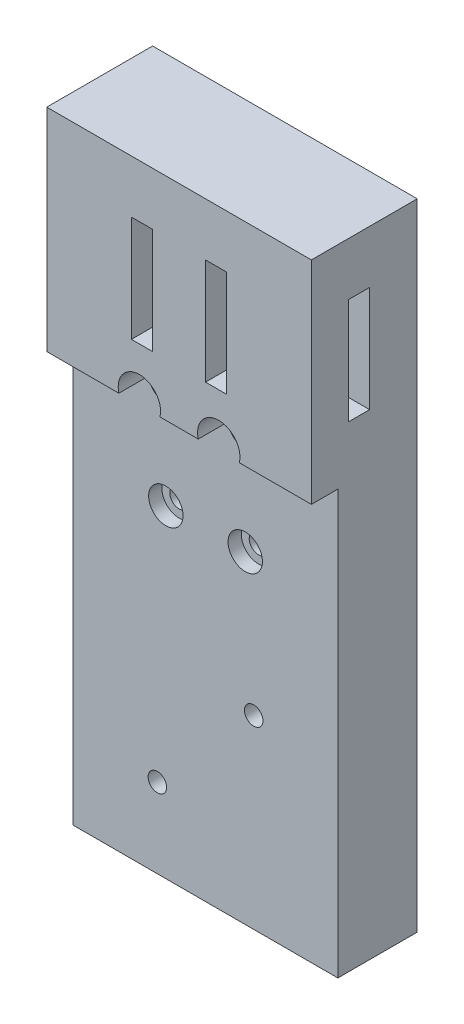
ISO-10303-21;
HEADER;
FILE_DESCRIPTION(('STEP AP214'),'2;1');
FILE_NAME('part.step','',(''),(''),'','','');
FILE_SCHEMA(('AUTOMOTIVE_DESIGN { 1 0 10303 214 1 1 1 1 }'));
ENDSEC;
DATA;
#1=APPLICATION_CONTEXT('core data for automotive mechanical design processes');
#2=APPLICATION_PROTOCOL_DEFINITION('international standard','automotive_design',2000,#1);
#3=PRODUCT_CONTEXT('',#1,'mechanical');
#4=PRODUCT('Part','Part','',(#3));
#5=PRODUCT_RELATED_PRODUCT_CATEGORY('part','',(#4));
#6=PRODUCT_DEFINITION_FORMATION('','',#4);
#7=PRODUCT_DEFINITION_CONTEXT('part definition',#1,'design');
#8=PRODUCT_DEFINITION('design','',#6,#7);
#9=PRODUCT_DEFINITION_SHAPE('','',#8);
#10=(LENGTH_UNIT() NAMED_UNIT(*) SI_UNIT(.MILLI.,.METRE.));
#11=(NAMED_UNIT(*) PLANE_ANGLE_UNIT() SI_UNIT($,.RADIAN.));
#12=(NAMED_UNIT(*) SI_UNIT($,.STERADIAN.) SOLID_ANGLE_UNIT());
#13=UNCERTAINTY_MEASURE_WITH_UNIT(LENGTH_MEASURE(1.E-05),#10,'distance_accuracy_value','');
#14=(GEOMETRIC_REPRESENTATION_CONTEXT(3) GLOBAL_UNCERTAINTY_ASSIGNED_CONTEXT((#13)) GLOBAL_UNIT_ASSIGNED_CONTEXT((#10,
#11,#12)) REPRESENTATION_CONTEXT('',''));
#15=CARTESIAN_POINT('',(0.,0.,0.));
#16=DIRECTION('',(0.,0.,1.));
#17=DIRECTION('',(1.,0.,0.));
#18=AXIS2_PLACEMENT_3D('',#15,#16,#17);
#19=CARTESIAN_POINT('',(32.5000000000006,61.0000000000162,0.));
#20=DIRECTION('',(0.,0.,1.));
#21=DIRECTION('',(1.,0.,0.));
#22=AXIS2_PLACEMENT_3D('',#19,#20,#21);
#23=CYLINDRICAL_SURFACE('',#22,1.74999999999952);
#24=CARTESIAN_POINT('',(32.5000000000006,61.0000000000162,0.));
#25=DIRECTION('',(0.,0.,1.));
#26=DIRECTION('',(1.,0.,0.));
#27=AXIS2_PLACEMENT_3D('',#24,#25,#26);
#28=CIRCLE('',#27,1.74999999999952);
#29=CARTESIAN_POINT('',(34.2500000000001,61.0000000000162,0.));
#30=VERTEX_POINT('',#29);
#31=EDGE_CURVE('E288',#30,#30,#28,.T.);
#32=ORIENTED_EDGE('',*,*,#31,.F.);
#33=EDGE_LOOP('',(#32));
#34=FACE_BOUND('',#33,.T.);
#35=CARTESIAN_POINT('',(32.5000000000006,61.0000000000162,12.5));
#36=DIRECTION('',(0.,0.,1.));
#37=DIRECTION('',(1.,0.,0.));
#38=AXIS2_PLACEMENT_3D('',#35,#36,#37);
#39=CIRCLE('',#38,1.74999999999952);
#40=CARTESIAN_POINT('',(34.2500000000001,61.0000000000162,12.5));
#41=VERTEX_POINT('',#40);
#42=EDGE_CURVE('E41',#41,#41,#39,.F.);
#43=ORIENTED_EDGE('',*,*,#42,.F.);
#44=EDGE_LOOP('',(#43));
#45=FACE_BOUND('',#44,.T.);
#46=ADVANCED_FACE('F37',(#34,#45),#23,.F.);
#47=CARTESIAN_POINT('',(17.5000000000006,61.0000000000163,0.));
#48=DIRECTION('',(0.,0.,1.));
#49=DIRECTION('',(1.,0.,0.));
#50=AXIS2_PLACEMENT_3D('',#47,#48,#49);
#51=CYLINDRICAL_SURFACE('',#50,1.74999999999951);
#52=CARTESIAN_POINT('',(17.5000000000006,61.0000000000163,0.));
#53=DIRECTION('',(0.,0.,1.));
#54=DIRECTION('',(1.,0.,0.));
#55=AXIS2_PLACEMENT_3D('',#52,#53,#54);
#56=CIRCLE('',#55,1.74999999999951);
#57=CARTESIAN_POINT('',(19.2500000000001,61.0000000000163,0.));
#58=VERTEX_POINT('',#57);
#59=EDGE_CURVE('E284',#58,#58,#56,.T.);
#60=ORIENTED_EDGE('',*,*,#59,.F.);
#61=EDGE_LOOP('',(#60));
#62=FACE_BOUND('',#61,.T.);
#63=CARTESIAN_POINT('',(17.5000000000006,61.0000000000163,12.5));
#64=DIRECTION('',(0.,0.,1.));
#65=DIRECTION('',(1.,0.,0.));
#66=AXIS2_PLACEMENT_3D('',#63,#64,#65);
#67=CIRCLE('',#66,1.74999999999951);
#68=CARTESIAN_POINT('',(19.2500000000001,61.0000000000163,12.5));
#69=VERTEX_POINT('',#68);
#70=EDGE_CURVE('E445',#69,#69,#67,.F.);
#71=ORIENTED_EDGE('',*,*,#70,.F.);
#72=EDGE_LOOP('',(#71));
#73=FACE_BOUND('',#72,.T.);
#74=ADVANCED_FACE('F455',(#62,#73),#51,.F.);
#75=CARTESIAN_POINT('',(32.5000000000005,41.0000000000162,0.));
#76=DIRECTION('',(0.,0.,1.));
#77=DIRECTION('',(1.,0.,0.));
#78=AXIS2_PLACEMENT_3D('',#75,#76,#77);
#79=CYLINDRICAL_SURFACE('',#78,1.74999999999952);
#80=CARTESIAN_POINT('',(32.5000000000005,41.0000000000162,0.));
#81=DIRECTION('',(0.,0.,1.));
#82=DIRECTION('',(1.,0.,0.));
#83=AXIS2_PLACEMENT_3D('',#80,#81,#82);
#84=CIRCLE('',#83,1.74999999999952);
#85=CARTESIAN_POINT('',(34.25,41.0000000000162,0.));
#86=VERTEX_POINT('',#85);
#87=EDGE_CURVE('E285',#86,#86,#84,.T.);
#88=ORIENTED_EDGE('',*,*,#87,.F.);
#89=EDGE_LOOP('',(#88));
#90=FACE_BOUND('',#89,.T.);
#91=CARTESIAN_POINT('',(32.5000000000005,41.0000000000162,12.5));
#92=DIRECTION('',(0.,0.,1.));
#93=DIRECTION('',(1.,0.,0.));
#94=AXIS2_PLACEMENT_3D('',#91,#92,#93);
#95=CIRCLE('',#94,1.74999999999952);
#96=CARTESIAN_POINT('',(34.25,41.0000000000162,12.5));
#97=VERTEX_POINT('',#96);
#98=EDGE_CURVE('E443',#97,#97,#95,.F.);
#99=ORIENTED_EDGE('',*,*,#98,.F.);
#100=EDGE_LOOP('',(#99));
#101=FACE_BOUND('',#100,.T.);
#102=ADVANCED_FACE('F461',(#90,#101),#79,.F.);
#103=CARTESIAN_POINT('',(17.5000000000005,41.0000000000163,0.));
#104=DIRECTION('',(0.,0.,1.));
#105=DIRECTION('',(1.,0.,0.));
#106=AXIS2_PLACEMENT_3D('',#103,#104,#105);
#107=CYLINDRICAL_SURFACE('',#106,1.74999999999951);
#108=CARTESIAN_POINT('',(17.5000000000005,41.0000000000163,0.));
#109=DIRECTION('',(0.,0.,1.));
#110=DIRECTION('',(1.,0.,0.));
#111=AXIS2_PLACEMENT_3D('',#108,#109,#110);
#112=CIRCLE('',#111,1.74999999999951);
#113=CARTESIAN_POINT('',(19.25,41.0000000000163,0.));
#114=VERTEX_POINT('',#113);
#115=EDGE_CURVE('E289',#114,#114,#112,.T.);
#116=ORIENTED_EDGE('',*,*,#115,.F.);
#117=EDGE_LOOP('',(#116));
#118=FACE_BOUND('',#117,.T.);
#119=CARTESIAN_POINT('',(17.5000000000005,41.0000000000163,12.5));
#120=DIRECTION('',(0.,0.,1.));
#121=DIRECTION('',(1.,0.,0.));
#122=AXIS2_PLACEMENT_3D('',#119,#120,#121);
#123=CIRCLE('',#122,1.74999999999951);
#124=CARTESIAN_POINT('',(19.25,41.0000000000163,12.5));
#125=VERTEX_POINT('',#124);
#126=EDGE_CURVE('E265',#125,#125,#123,.F.);
#127=ORIENTED_EDGE('',*,*,#126,.F.);
#128=EDGE_LOOP('',(#127));
#129=FACE_BOUND('',#128,.T.);
#130=ADVANCED_FACE('F608',(#118,#129),#107,.F.);
#131=CARTESIAN_POINT('',(50.,60.,0.));
#132=DIRECTION('',(0.,-1.,0.));
#133=DIRECTION('',(0.,0.,-1.));
#134=AXIS2_PLACEMENT_3D('',#131,#132,#133);
#135=PLANE('',#134);
#136=DIRECTION('',(0.,0.,1.));
#137=VECTOR('',#136,1.);
#138=CARTESIAN_POINT('',(28.6270166537979,60.,3.68629150101662));
#139=LINE('',#138,#137);
#140=CARTESIAN_POINT('',(28.6270166537979,60.,20.));
#141=VERTEX_POINT('',#140);
#142=CARTESIAN_POINT('',(28.6270166537979,60.,15.));
#143=VERTEX_POINT('',#142);
#144=EDGE_CURVE('E282',#141,#143,#139,.F.);
#145=ORIENTED_EDGE('',*,*,#144,.F.);
#146=DIRECTION('',(-1.,0.,0.));
#147=VECTOR('',#146,1.);
#148=CARTESIAN_POINT('',(50.,60.,20.));
#149=LINE('',#148,#147);
#150=CARTESIAN_POINT('',(21.3729833462033,60.,20.));
#151=VERTEX_POINT('',#150);
#152=EDGE_CURVE('E309',#141,#151,#149,.T.);
#153=ORIENTED_EDGE('',*,*,#152,.T.);
#154=DIRECTION('',(0.,0.,1.));
#155=VECTOR('',#154,1.);
#156=CARTESIAN_POINT('',(21.3729833462033,60.,3.68629150101662));
#157=LINE('',#156,#155);
#158=CARTESIAN_POINT('',(21.3729833462033,60.,15.));
#159=VERTEX_POINT('',#158);
#160=EDGE_CURVE('E278',#159,#151,#157,.T.);
#161=ORIENTED_EDGE('',*,*,#160,.F.);
#162=DIRECTION('',(-1.,0.,0.));
#163=VECTOR('',#162,1.);
#164=CARTESIAN_POINT('',(50.,60.,15.));
#165=LINE('',#164,#163);
#166=EDGE_CURVE('E314',#143,#159,#165,.T.);
#167=ORIENTED_EDGE('',*,*,#166,.F.);
#168=EDGE_LOOP('',(#145,#153,#161,#167));
#169=FACE_BOUND('',#168,.T.);
#170=ADVANCED_FACE('F477',(#169),#135,.T.);
#171=DIRECTION('',(0.,0.,1.));
#172=VECTOR('',#171,1.);
#173=CARTESIAN_POINT('',(36.3729833462033,60.,3.68629150101662));
#174=LINE('',#173,#172);
#175=CARTESIAN_POINT('',(36.3729833462033,60.,15.));
#176=VERTEX_POINT('',#175);
#177=CARTESIAN_POINT('',(36.3729833462033,60.,20.));
#178=VERTEX_POINT('',#177);
#179=EDGE_CURVE('E280',#176,#178,#174,.T.);
#180=ORIENTED_EDGE('',*,*,#179,.F.);
#181=CARTESIAN_POINT('',(50.,60.,15.));
#182=VERTEX_POINT('',#181);
#183=EDGE_CURVE('E311',#182,#176,#165,.T.);
#184=ORIENTED_EDGE('',*,*,#183,.F.);
#185=DIRECTION('',(0.,0.,1.));
#186=VECTOR('',#185,1.);
#187=CARTESIAN_POINT('',(50.,60.,0.));
#188=LINE('',#187,#186);
#189=CARTESIAN_POINT('',(50.,60.,20.));
#190=VERTEX_POINT('',#189);
#191=EDGE_CURVE('E297',#182,#190,#188,.T.);
#192=ORIENTED_EDGE('',*,*,#191,.T.);
#193=EDGE_CURVE('E306',#190,#178,#149,.T.);
#194=ORIENTED_EDGE('',*,*,#193,.T.);
#195=EDGE_LOOP('',(#180,#184,#192,#194));
#196=FACE_BOUND('',#195,.T.);
#197=ADVANCED_FACE('F478',(#196),#135,.T.);
#198=CARTESIAN_POINT('',(0.,0.,20.));
#199=DIRECTION('',(0.,0.,-1.));
#200=DIRECTION('',(-1.,0.,0.));
#201=AXIS2_PLACEMENT_3D('',#198,#199,#200);
#202=PLANE('',#201);
#203=DIRECTION('',(0.,-1.,0.));
#204=VECTOR('',#203,1.);
#205=CARTESIAN_POINT('',(34.,90.,20.));
#206=LINE('',#205,#204);
#207=CARTESIAN_POINT('',(34.,90.,20.));
#208=VERTEX_POINT('',#207);
#209=CARTESIAN_POINT('',(34.,70.,20.));
#210=VERTEX_POINT('',#209);
#211=EDGE_CURVE('E54',#208,#210,#206,.T.);
#212=ORIENTED_EDGE('',*,*,#211,.T.);
#213=DIRECTION('',(-1.,0.,0.));
#214=VECTOR('',#213,1.);
#215=CARTESIAN_POINT('',(34.,70.,20.));
#216=LINE('',#215,#214);
#217=CARTESIAN_POINT('',(30.,70.,20.));
#218=VERTEX_POINT('',#217);
#219=EDGE_CURVE('E319',#210,#218,#216,.T.);
#220=ORIENTED_EDGE('',*,*,#219,.T.);
#221=DIRECTION('',(0.,1.,0.));
#222=VECTOR('',#221,1.);
#223=CARTESIAN_POINT('',(30.,90.,20.));
#224=LINE('',#223,#222);
#225=CARTESIAN_POINT('',(30.,90.,20.));
#226=VERTEX_POINT('',#225);
#227=EDGE_CURVE('E332',#218,#226,#224,.T.);
#228=ORIENTED_EDGE('',*,*,#227,.T.);
#229=DIRECTION('',(1.,0.,0.));
#230=VECTOR('',#229,1.);
#231=CARTESIAN_POINT('',(34.,90.,20.));
#232=LINE('',#231,#230);
#233=EDGE_CURVE('E329',#226,#208,#232,.T.);
#234=ORIENTED_EDGE('',*,*,#233,.T.);
#235=EDGE_LOOP('',(#212,#220,#228,#234));
#236=FACE_BOUND('',#235,.T.);
#237=DIRECTION('',(1.,0.,0.));
#238=VECTOR('',#237,1.);
#239=CARTESIAN_POINT('',(16.,70.,20.));
#240=LINE('',#239,#238);
#241=CARTESIAN_POINT('',(16.,70.,20.));
#242=VERTEX_POINT('',#241);
#243=CARTESIAN_POINT('',(20.,70.,20.));
#244=VERTEX_POINT('',#243);
#245=EDGE_CURVE('E387',#242,#244,#240,.T.);
#246=ORIENTED_EDGE('',*,*,#245,.F.);
#247=DIRECTION('',(0.,-1.,0.));
#248=VECTOR('',#247,1.);
#249=CARTESIAN_POINT('',(16.,90.,20.));
#250=LINE('',#249,#248);
#251=CARTESIAN_POINT('',(16.,90.,20.));
#252=VERTEX_POINT('',#251);
#253=EDGE_CURVE('E366',#252,#242,#250,.T.);
#254=ORIENTED_EDGE('',*,*,#253,.F.);
#255=DIRECTION('',(-1.,0.,0.));
#256=VECTOR('',#255,1.);
#257=CARTESIAN_POINT('',(16.,90.,20.));
#258=LINE('',#257,#256);
#259=CARTESIAN_POINT('',(20.,90.,20.));
#260=VERTEX_POINT('',#259);
#261=EDGE_CURVE('E376',#260,#252,#258,.T.);
#262=ORIENTED_EDGE('',*,*,#261,.F.);
#263=DIRECTION('',(0.,1.,0.));
#264=VECTOR('',#263,1.);
#265=CARTESIAN_POINT('',(20.,90.,20.));
#266=LINE('',#265,#264);
#267=EDGE_CURVE('E390',#244,#260,#266,.T.);
#268=ORIENTED_EDGE('',*,*,#267,.F.);
#269=EDGE_LOOP('',(#246,#254,#262,#268));
#270=FACE_BOUND('',#269,.T.);
#271=ORIENTED_EDGE('',*,*,#152,.F.);
#272=CARTESIAN_POINT('',(32.5000000000006,61.0000000000162,20.));
#273=DIRECTION('',(0.,0.,1.));
#274=DIRECTION('',(1.,0.,0.));
#275=AXIS2_PLACEMENT_3D('',#272,#273,#274);
#276=CIRCLE('',#275,3.99999999999951);
#277=EDGE_CURVE('E268',#178,#141,#276,.T.);
#278=ORIENTED_EDGE('',*,*,#277,.F.);
#279=ORIENTED_EDGE('',*,*,#193,.F.);
#280=DIRECTION('',(0.,1.,0.));
#281=VECTOR('',#280,1.);
#282=CARTESIAN_POINT('',(50.,0.,20.));
#283=LINE('',#282,#281);
#284=CARTESIAN_POINT('',(50.,100.,20.));
#285=VERTEX_POINT('',#284);
#286=EDGE_CURVE('E433',#190,#285,#283,.T.);
#287=ORIENTED_EDGE('',*,*,#286,.T.);
#288=DIRECTION('',(-1.,0.,0.));
#289=VECTOR('',#288,1.);
#290=CARTESIAN_POINT('',(0.,100.,20.));
#291=LINE('',#290,#289);
#292=CARTESIAN_POINT('',(0.,100.,20.));
#293=VERTEX_POINT('',#292);
#294=EDGE_CURVE('E435',#285,#293,#291,.T.);
#295=ORIENTED_EDGE('',*,*,#294,.T.);
#296=DIRECTION('',(0.,-1.,0.));
#297=VECTOR('',#296,1.);
#298=CARTESIAN_POINT('',(0.,0.,20.));
#299=LINE('',#298,#297);
#300=CARTESIAN_POINT('',(0.,60.,20.));
#301=VERTEX_POINT('',#300);
#302=EDGE_CURVE('E430',#293,#301,#299,.T.);
#303=ORIENTED_EDGE('',*,*,#302,.T.);
#304=CARTESIAN_POINT('',(13.6270166537979,60.,20.));
#305=VERTEX_POINT('',#304);
#306=EDGE_CURVE('E310',#305,#301,#149,.T.);
#307=ORIENTED_EDGE('',*,*,#306,.F.);
#308=CARTESIAN_POINT('',(17.5000000000006,61.0000000000163,20.));
#309=DIRECTION('',(0.,0.,1.));
#310=DIRECTION('',(1.,0.,0.));
#311=AXIS2_PLACEMENT_3D('',#308,#309,#310);
#312=CIRCLE('',#311,3.99999999999951);
#313=EDGE_CURVE('E271',#151,#305,#312,.T.);
#314=ORIENTED_EDGE('',*,*,#313,.F.);
#315=EDGE_LOOP('',(#271,#278,#279,#287,#295,#303,#307,#314));
#316=FACE_BOUND('',#315,.T.);
#317=ADVANCED_FACE('F535',(#236,#270,#316),#202,.F.);
#318=CARTESIAN_POINT('',(50.,0.,20.));
#319=DIRECTION('',(-1.,0.,0.));
#320=DIRECTION('',(0.,0.,1.));
#321=AXIS2_PLACEMENT_3D('',#318,#319,#320);
#322=PLANE('',#321);
#323=DIRECTION('',(0.,-1.,0.));
#324=VECTOR('',#323,1.);
#325=CARTESIAN_POINT('',(50.,90.,8.99999999999999));
#326=LINE('',#325,#324);
#327=CARTESIAN_POINT('',(50.,90.,8.99999999999999));
#328=VERTEX_POINT('',#327);
#329=CARTESIAN_POINT('',(50.,70.,9.));
#330=VERTEX_POINT('',#329);
#331=EDGE_CURVE('E347',#328,#330,#326,.T.);
#332=ORIENTED_EDGE('',*,*,#331,.T.);
#333=DIRECTION('',(0.,0.,1.));
#334=VECTOR('',#333,1.);
#335=CARTESIAN_POINT('',(50.,70.,9.));
#336=LINE('',#335,#334);
#337=CARTESIAN_POINT('',(50.,70.,13.));
#338=VERTEX_POINT('',#337);
#339=EDGE_CURVE('E351',#330,#338,#336,.T.);
#340=ORIENTED_EDGE('',*,*,#339,.T.);
#341=DIRECTION('',(0.,1.,0.));
#342=VECTOR('',#341,1.);
#343=CARTESIAN_POINT('',(50.,90.,13.));
#344=LINE('',#343,#342);
#345=CARTESIAN_POINT('',(50.,90.,13.));
#346=VERTEX_POINT('',#345);
#347=EDGE_CURVE('E359',#338,#346,#344,.T.);
#348=ORIENTED_EDGE('',*,*,#347,.T.);
#349=DIRECTION('',(0.,0.,-1.));
#350=VECTOR('',#349,1.);
#351=CARTESIAN_POINT('',(50.,90.,8.99999999999999));
#352=LINE('',#351,#350);
#353=EDGE_CURVE('E356',#346,#328,#352,.T.);
#354=ORIENTED_EDGE('',*,*,#353,.T.);
#355=EDGE_LOOP('',(#332,#340,#348,#354));
#356=FACE_BOUND('',#355,.T.);
#357=ORIENTED_EDGE('',*,*,#191,.F.);
#358=DIRECTION('',(0.,1.,0.));
#359=VECTOR('',#358,1.);
#360=CARTESIAN_POINT('',(50.,0.,15.));
#361=LINE('',#360,#359);
#362=CARTESIAN_POINT('',(50.,-20.,15.));
#363=VERTEX_POINT('',#362);
#364=EDGE_CURVE('E228',#363,#182,#361,.T.);
#365=ORIENTED_EDGE('',*,*,#364,.F.);
#366=DIRECTION('',(0.,0.,1.));
#367=VECTOR('',#366,1.);
#368=CARTESIAN_POINT('',(50.,-20.,-53.851648071345));
#369=LINE('',#368,#367);
#370=CARTESIAN_POINT('',(50.,-20.,0.));
#371=VERTEX_POINT('',#370);
#372=EDGE_CURVE('E225',#371,#363,#369,.T.);
#373=ORIENTED_EDGE('',*,*,#372,.F.);
#374=DIRECTION('',(0.,1.,0.));
#375=VECTOR('',#374,1.);
#376=CARTESIAN_POINT('',(50.,0.,0.));
#377=LINE('',#376,#375);
#378=CARTESIAN_POINT('',(50.,100.,0.));
#379=VERTEX_POINT('',#378);
#380=EDGE_CURVE('E212',#371,#379,#377,.T.);
#381=ORIENTED_EDGE('',*,*,#380,.T.);
#382=DIRECTION('',(0.,0.,-1.));
#383=VECTOR('',#382,1.);
#384=CARTESIAN_POINT('',(50.,100.,20.));
#385=LINE('',#384,#383);
#386=EDGE_CURVE('E11',#285,#379,#385,.T.);
#387=ORIENTED_EDGE('',*,*,#386,.F.);
#388=ORIENTED_EDGE('',*,*,#286,.F.);
#389=EDGE_LOOP('',(#357,#365,#373,#381,#387,#388));
#390=FACE_BOUND('',#389,.T.);
#391=ADVANCED_FACE('F227',(#356,#390),#322,.F.);
#392=CARTESIAN_POINT('',(0.,0.,20.));
#393=DIRECTION('',(1.,0.,0.));
#394=DIRECTION('',(0.,0.,-1.));
#395=AXIS2_PLACEMENT_3D('',#392,#393,#394);
#396=PLANE('',#395);
#397=DIRECTION('',(0.,0.,1.));
#398=VECTOR('',#397,1.);
#399=CARTESIAN_POINT('',(0.,70.,9.));
#400=LINE('',#399,#398);
#401=CARTESIAN_POINT('',(0.,70.,9.));
#402=VERTEX_POINT('',#401);
#403=CARTESIAN_POINT('',(0.,70.,13.));
#404=VERTEX_POINT('',#403);
#405=EDGE_CURVE('E415',#402,#404,#400,.T.);
#406=ORIENTED_EDGE('',*,*,#405,.F.);
#407=DIRECTION('',(0.,-1.,0.));
#408=VECTOR('',#407,1.);
#409=CARTESIAN_POINT('',(0.,90.,8.99999999999999));
#410=LINE('',#409,#408);
#411=CARTESIAN_POINT('',(0.,90.,8.99999999999999));
#412=VERTEX_POINT('',#411);
#413=EDGE_CURVE('E406',#412,#402,#410,.T.);
#414=ORIENTED_EDGE('',*,*,#413,.F.);
#415=DIRECTION('',(0.,0.,-1.));
#416=VECTOR('',#415,1.);
#417=CARTESIAN_POINT('',(0.,90.,8.99999999999999));
#418=LINE('',#417,#416);
#419=CARTESIAN_POINT('',(0.,90.,13.));
#420=VERTEX_POINT('',#419);
#421=EDGE_CURVE('E410',#420,#412,#418,.T.);
#422=ORIENTED_EDGE('',*,*,#421,.F.);
#423=DIRECTION('',(0.,1.,0.));
#424=VECTOR('',#423,1.);
#425=CARTESIAN_POINT('',(0.,90.,13.));
#426=LINE('',#425,#424);
#427=EDGE_CURVE('E418',#404,#420,#426,.T.);
#428=ORIENTED_EDGE('',*,*,#427,.F.);
#429=EDGE_LOOP('',(#406,#414,#422,#428));
#430=FACE_BOUND('',#429,.T.);
#431=DIRECTION('',(0.,0.,1.));
#432=VECTOR('',#431,1.);
#433=CARTESIAN_POINT('',(0.,60.,0.));
#434=LINE('',#433,#432);
#435=CARTESIAN_POINT('',(0.,60.,15.));
#436=VERTEX_POINT('',#435);
#437=EDGE_CURVE('E296',#436,#301,#434,.T.);
#438=ORIENTED_EDGE('',*,*,#437,.T.);
#439=ORIENTED_EDGE('',*,*,#302,.F.);
#440=DIRECTION('',(0.,0.,-1.));
#441=VECTOR('',#440,1.);
#442=CARTESIAN_POINT('',(0.,100.,20.));
#443=LINE('',#442,#441);
#444=CARTESIAN_POINT('',(0.,100.,0.));
#445=VERTEX_POINT('',#444);
#446=EDGE_CURVE('E46',#293,#445,#443,.T.);
#447=ORIENTED_EDGE('',*,*,#446,.T.);
#448=DIRECTION('',(0.,-1.,0.));
#449=VECTOR('',#448,1.);
#450=CARTESIAN_POINT('',(0.,0.,0.));
#451=LINE('',#450,#449);
#452=CARTESIAN_POINT('',(0.,-20.,0.));
#453=VERTEX_POINT('',#452);
#454=EDGE_CURVE('E222',#445,#453,#451,.T.);
#455=ORIENTED_EDGE('',*,*,#454,.T.);
#456=DIRECTION('',(0.,0.,1.));
#457=VECTOR('',#456,1.);
#458=CARTESIAN_POINT('',(0.,-20.,-53.851648071345));
#459=LINE('',#458,#457);
#460=CARTESIAN_POINT('',(0.,-20.,15.));
#461=VERTEX_POINT('',#460);
#462=EDGE_CURVE('E232',#453,#461,#459,.T.);
#463=ORIENTED_EDGE('',*,*,#462,.T.);
#464=DIRECTION('',(0.,1.,0.));
#465=VECTOR('',#464,1.);
#466=CARTESIAN_POINT('',(0.,0.,15.));
#467=LINE('',#466,#465);
#468=EDGE_CURVE('E299',#461,#436,#467,.T.);
#469=ORIENTED_EDGE('',*,*,#468,.T.);
#470=EDGE_LOOP('',(#438,#439,#447,#455,#463,#469));
#471=FACE_BOUND('',#470,.T.);
#472=ADVANCED_FACE('F39',(#430,#471),#396,.F.);
#473=CARTESIAN_POINT('',(30.,90.,8.99999999999999));
#474=DIRECTION('',(0.,0.,1.));
#475=DIRECTION('',(0.,-1.,0.));
#476=AXIS2_PLACEMENT_3D('',#473,#474,#475);
#477=PLANE('',#476);
#478=DIRECTION('',(1.,0.,0.));
#479=VECTOR('',#478,1.);
#480=CARTESIAN_POINT('',(30.,90.,8.99999999999999));
#481=LINE('',#480,#479);
#482=CARTESIAN_POINT('',(34.,90.,8.99999999999999));
#483=VERTEX_POINT('',#482);
#484=EDGE_CURVE('E353',#483,#328,#481,.T.);
#485=ORIENTED_EDGE('',*,*,#484,.F.);
#486=DIRECTION('',(0.,-1.,0.));
#487=VECTOR('',#486,1.);
#488=CARTESIAN_POINT('',(34.,90.,8.99999999999999));
#489=LINE('',#488,#487);
#490=CARTESIAN_POINT('',(34.,70.,9.));
#491=VERTEX_POINT('',#490);
#492=EDGE_CURVE('E344',#483,#491,#489,.T.);
#493=ORIENTED_EDGE('',*,*,#492,.T.);
#494=DIRECTION('',(1.,0.,0.));
#495=VECTOR('',#494,1.);
#496=CARTESIAN_POINT('',(30.,70.,9.));
#497=LINE('',#496,#495);
#498=EDGE_CURVE('E364',#491,#330,#497,.T.);
#499=ORIENTED_EDGE('',*,*,#498,.T.);
#500=ORIENTED_EDGE('',*,*,#331,.F.);
#501=EDGE_LOOP('',(#485,#493,#499,#500));
#502=FACE_BOUND('',#501,.T.);
#503=ADVANCED_FACE('F500',(#502),#477,.T.);
#504=CARTESIAN_POINT('',(30.,90.,13.));
#505=DIRECTION('',(0.,0.,-1.));
#506=DIRECTION('',(-1.,0.,0.));
#507=AXIS2_PLACEMENT_3D('',#504,#505,#506);
#508=PLANE('',#507);
#509=DIRECTION('',(1.,0.,0.));
#510=VECTOR('',#509,1.);
#511=CARTESIAN_POINT('',(30.,70.,13.));
#512=LINE('',#511,#510);
#513=CARTESIAN_POINT('',(34.,70.,13.));
#514=VERTEX_POINT('',#513);
#515=EDGE_CURVE('E367',#514,#338,#512,.T.);
#516=ORIENTED_EDGE('',*,*,#515,.F.);
#517=DIRECTION('',(0.,1.,0.));
#518=VECTOR('',#517,1.);
#519=CARTESIAN_POINT('',(34.,90.,13.));
#520=LINE('',#519,#518);
#521=CARTESIAN_POINT('',(34.,90.,13.));
#522=VERTEX_POINT('',#521);
#523=EDGE_CURVE('E339',#514,#522,#520,.T.);
#524=ORIENTED_EDGE('',*,*,#523,.T.);
#525=DIRECTION('',(1.,0.,0.));
#526=VECTOR('',#525,1.);
#527=CARTESIAN_POINT('',(30.,90.,13.));
#528=LINE('',#527,#526);
#529=EDGE_CURVE('E369',#522,#346,#528,.T.);
#530=ORIENTED_EDGE('',*,*,#529,.T.);
#531=ORIENTED_EDGE('',*,*,#347,.F.);
#532=EDGE_LOOP('',(#516,#524,#530,#531));
#533=FACE_BOUND('',#532,.T.);
#534=ADVANCED_FACE('F496',(#533),#508,.T.);
#535=CARTESIAN_POINT('',(0.,100.,20.));
#536=DIRECTION('',(0.,-1.,0.));
#537=DIRECTION('',(0.,0.,-1.));
#538=AXIS2_PLACEMENT_3D('',#535,#536,#537);
#539=PLANE('',#538);
#540=DIRECTION('',(-1.,0.,0.));
#541=VECTOR('',#540,1.);
#542=CARTESIAN_POINT('',(0.,100.,0.));
#543=LINE('',#542,#541);
#544=EDGE_CURVE('E219',#379,#445,#543,.T.);
#545=ORIENTED_EDGE('',*,*,#544,.T.);
#546=ORIENTED_EDGE('',*,*,#446,.F.);
#547=ORIENTED_EDGE('',*,*,#294,.F.);
#548=ORIENTED_EDGE('',*,*,#386,.T.);
#549=EDGE_LOOP('',(#545,#546,#547,#548));
#550=FACE_BOUND('',#549,.T.);
#551=ADVANCED_FACE('F499',(#550),#539,.F.);
#552=CARTESIAN_POINT('',(0.,0.,0.));
#553=DIRECTION('',(0.,0.,-1.));
#554=DIRECTION('',(-1.,0.,0.));
#555=AXIS2_PLACEMENT_3D('',#552,#553,#554);
#556=PLANE('',#555);
#557=CARTESIAN_POINT('',(34.1,15.,0.));
#558=DIRECTION('',(0.,0.,1.));
#559=DIRECTION('',(1.,0.,0.));
#560=AXIS2_PLACEMENT_3D('',#557,#558,#559);
#561=CIRCLE('',#560,1.75);
#562=CARTESIAN_POINT('',(35.85,15.,0.));
#563=VERTEX_POINT('',#562);
#564=EDGE_CURVE('E238',#563,#563,#561,.T.);
#565=ORIENTED_EDGE('',*,*,#564,.T.);
#566=EDGE_LOOP('',(#565));
#567=FACE_BOUND('',#566,.T.);
#568=CARTESIAN_POINT('',(15.9,-5.00000000000001,0.));
#569=DIRECTION('',(0.,0.,1.));
#570=DIRECTION('',(1.,0.,0.));
#571=AXIS2_PLACEMENT_3D('',#568,#569,#570);
#572=CIRCLE('',#571,1.75);
#573=CARTESIAN_POINT('',(17.65,-5.00000000000001,0.));
#574=VERTEX_POINT('',#573);
#575=EDGE_CURVE('E1061',#574,#574,#572,.T.);
#576=ORIENTED_EDGE('',*,*,#575,.T.);
#577=EDGE_LOOP('',(#576));
#578=FACE_BOUND('',#577,.T.);
#579=ORIENTED_EDGE('',*,*,#59,.T.);
#580=EDGE_LOOP('',(#579));
#581=FACE_BOUND('',#580,.T.);
#582=ORIENTED_EDGE('',*,*,#115,.T.);
#583=EDGE_LOOP('',(#582));
#584=FACE_BOUND('',#583,.T.);
#585=ORIENTED_EDGE('',*,*,#87,.T.);
#586=EDGE_LOOP('',(#585));
#587=FACE_BOUND('',#586,.T.);
#588=ORIENTED_EDGE('',*,*,#31,.T.);
#589=EDGE_LOOP('',(#588));
#590=FACE_BOUND('',#589,.T.);
#591=ORIENTED_EDGE('',*,*,#454,.F.);
#592=ORIENTED_EDGE('',*,*,#544,.F.);
#593=ORIENTED_EDGE('',*,*,#380,.F.);
#594=DIRECTION('',(1.,0.,0.));
#595=VECTOR('',#594,1.);
#596=CARTESIAN_POINT('',(0.,-20.,0.));
#597=LINE('',#596,#595);
#598=EDGE_CURVE('E217',#453,#371,#597,.T.);
#599=ORIENTED_EDGE('',*,*,#598,.F.);
#600=EDGE_LOOP('',(#591,#592,#593,#599));
#601=FACE_BOUND('',#600,.T.);
#602=ADVANCED_FACE('F215',(#567,#578,#581,#584,#587,#590,#601),#556,.T.);
#603=CARTESIAN_POINT('',(20.,90.,8.99999999999999));
#604=DIRECTION('',(0.,0.,-1.));
#605=DIRECTION('',(0.,1.,0.));
#606=AXIS2_PLACEMENT_3D('',#603,#604,#605);
#607=PLANE('',#606);
#608=DIRECTION('',(-1.,0.,0.));
#609=VECTOR('',#608,1.);
#610=CARTESIAN_POINT('',(20.,70.,9.));
#611=LINE('',#610,#609);
#612=CARTESIAN_POINT('',(16.,70.,9.));
#613=VERTEX_POINT('',#612);
#614=EDGE_CURVE('E412',#613,#402,#611,.T.);
#615=ORIENTED_EDGE('',*,*,#614,.F.);
#616=DIRECTION('',(0.,1.,0.));
#617=VECTOR('',#616,1.);
#618=CARTESIAN_POINT('',(16.,90.,8.99999999999999));
#619=LINE('',#618,#617);
#620=CARTESIAN_POINT('',(16.,90.,8.99999999999999));
#621=VERTEX_POINT('',#620);
#622=EDGE_CURVE('E403',#613,#621,#619,.T.);
#623=ORIENTED_EDGE('',*,*,#622,.T.);
#624=DIRECTION('',(-1.,0.,0.));
#625=VECTOR('',#624,1.);
#626=CARTESIAN_POINT('',(20.,90.,8.99999999999999));
#627=LINE('',#626,#625);
#628=EDGE_CURVE('E423',#621,#412,#627,.T.);
#629=ORIENTED_EDGE('',*,*,#628,.T.);
#630=ORIENTED_EDGE('',*,*,#413,.T.);
#631=EDGE_LOOP('',(#615,#623,#629,#630));
#632=FACE_BOUND('',#631,.T.);
#633=ADVANCED_FACE('F524',(#632),#607,.F.);
#634=CARTESIAN_POINT('',(20.,90.,8.99999999999999));
#635=DIRECTION('',(0.,1.,0.));
#636=DIRECTION('',(0.,0.,1.));
#637=AXIS2_PLACEMENT_3D('',#634,#635,#636);
#638=PLANE('',#637);
#639=ORIENTED_EDGE('',*,*,#628,.F.);
#640=DIRECTION('',(0.,0.,1.));
#641=VECTOR('',#640,1.);
#642=CARTESIAN_POINT('',(16.,90.,4.));
#643=LINE('',#642,#641);
#644=CARTESIAN_POINT('',(16.,90.,4.));
#645=VERTEX_POINT('',#644);
#646=EDGE_CURVE('E395',#645,#621,#643,.T.);
#647=ORIENTED_EDGE('',*,*,#646,.F.);
#648=DIRECTION('',(-1.,0.,0.));
#649=VECTOR('',#648,1.);
#650=CARTESIAN_POINT('',(16.,90.,4.));
#651=LINE('',#650,#649);
#652=CARTESIAN_POINT('',(20.,90.,4.));
#653=VERTEX_POINT('',#652);
#654=EDGE_CURVE('E382',#653,#645,#651,.T.);
#655=ORIENTED_EDGE('',*,*,#654,.F.);
#656=DIRECTION('',(0.,0.,-1.));
#657=VECTOR('',#656,1.);
#658=CARTESIAN_POINT('',(20.,90.,8.99999999999999));
#659=LINE('',#658,#657);
#660=EDGE_CURVE('E409',#260,#653,#659,.T.);
#661=ORIENTED_EDGE('',*,*,#660,.F.);
#662=ORIENTED_EDGE('',*,*,#261,.T.);
#663=CARTESIAN_POINT('',(16.,90.,13.));
#664=VERTEX_POINT('',#663);
#665=EDGE_CURVE('E398',#664,#252,#643,.T.);
#666=ORIENTED_EDGE('',*,*,#665,.F.);
#667=DIRECTION('',(-1.,0.,0.));
#668=VECTOR('',#667,1.);
#669=CARTESIAN_POINT('',(20.,90.,13.));
#670=LINE('',#669,#668);
#671=EDGE_CURVE('E425',#664,#420,#670,.T.);
#672=ORIENTED_EDGE('',*,*,#671,.T.);
#673=ORIENTED_EDGE('',*,*,#421,.T.);
#674=EDGE_LOOP('',(#639,#647,#655,#661,#662,#666,#672,#673));
#675=FACE_BOUND('',#674,.T.);
#676=ADVANCED_FACE('F520',(#675),#638,.F.);
#677=CARTESIAN_POINT('',(20.,90.,13.));
#678=DIRECTION('',(0.,0.,1.));
#679=DIRECTION('',(1.,0.,0.));
#680=AXIS2_PLACEMENT_3D('',#677,#678,#679);
#681=PLANE('',#680);
#682=ORIENTED_EDGE('',*,*,#671,.F.);
#683=DIRECTION('',(0.,-1.,0.));
#684=VECTOR('',#683,1.);
#685=CARTESIAN_POINT('',(16.,90.,13.));
#686=LINE('',#685,#684);
#687=CARTESIAN_POINT('',(16.,70.,13.));
#688=VERTEX_POINT('',#687);
#689=EDGE_CURVE('E397',#664,#688,#686,.T.);
#690=ORIENTED_EDGE('',*,*,#689,.T.);
#691=DIRECTION('',(-1.,0.,0.));
#692=VECTOR('',#691,1.);
#693=CARTESIAN_POINT('',(20.,70.,13.));
#694=LINE('',#693,#692);
#695=EDGE_CURVE('E427',#688,#404,#694,.T.);
#696=ORIENTED_EDGE('',*,*,#695,.T.);
#697=ORIENTED_EDGE('',*,*,#427,.T.);
#698=EDGE_LOOP('',(#682,#690,#696,#697));
#699=FACE_BOUND('',#698,.T.);
#700=ADVANCED_FACE('F523',(#699),#681,.F.);
#701=CARTESIAN_POINT('',(20.,70.,9.));
#702=DIRECTION('',(0.,-1.,0.));
#703=DIRECTION('',(0.,0.,-1.));
#704=AXIS2_PLACEMENT_3D('',#701,#702,#703);
#705=PLANE('',#704);
#706=ORIENTED_EDGE('',*,*,#695,.F.);
#707=DIRECTION('',(0.,0.,1.));
#708=VECTOR('',#707,1.);
#709=CARTESIAN_POINT('',(16.,70.,4.));
#710=LINE('',#709,#708);
#711=EDGE_CURVE('E385',#688,#242,#710,.T.);
#712=ORIENTED_EDGE('',*,*,#711,.T.);
#713=ORIENTED_EDGE('',*,*,#245,.T.);
#714=DIRECTION('',(0.,0.,1.));
#715=VECTOR('',#714,1.);
#716=CARTESIAN_POINT('',(20.,70.,9.));
#717=LINE('',#716,#715);
#718=CARTESIAN_POINT('',(20.,70.,4.));
#719=VERTEX_POINT('',#718);
#720=EDGE_CURVE('E407',#719,#244,#717,.T.);
#721=ORIENTED_EDGE('',*,*,#720,.F.);
#722=DIRECTION('',(1.,0.,0.));
#723=VECTOR('',#722,1.);
#724=CARTESIAN_POINT('',(16.,70.,4.));
#725=LINE('',#724,#723);
#726=CARTESIAN_POINT('',(16.,70.,4.));
#727=VERTEX_POINT('',#726);
#728=EDGE_CURVE('E375',#727,#719,#725,.T.);
#729=ORIENTED_EDGE('',*,*,#728,.F.);
#730=EDGE_CURVE('E399',#727,#613,#710,.T.);
#731=ORIENTED_EDGE('',*,*,#730,.T.);
#732=ORIENTED_EDGE('',*,*,#614,.T.);
#733=ORIENTED_EDGE('',*,*,#405,.T.);
#734=EDGE_LOOP('',(#706,#712,#713,#721,#729,#731,#732,#733));
#735=FACE_BOUND('',#734,.T.);
#736=ADVANCED_FACE('F518',(#735),#705,.F.);
#737=CARTESIAN_POINT('',(20.,0.,0.));
#738=DIRECTION('',(-1.,0.,0.));
#739=DIRECTION('',(0.,0.,1.));
#740=AXIS2_PLACEMENT_3D('',#737,#738,#739);
#741=PLANE('',#740);
#742=ORIENTED_EDGE('',*,*,#660,.T.);
#743=DIRECTION('',(0.,1.,0.));
#744=VECTOR('',#743,1.);
#745=CARTESIAN_POINT('',(20.,90.,4.));
#746=LINE('',#745,#744);
#747=EDGE_CURVE('E379',#719,#653,#746,.T.);
#748=ORIENTED_EDGE('',*,*,#747,.F.);
#749=ORIENTED_EDGE('',*,*,#720,.T.);
#750=ORIENTED_EDGE('',*,*,#267,.T.);
#751=EDGE_LOOP('',(#742,#748,#749,#750));
#752=FACE_BOUND('',#751,.T.);
#753=ADVANCED_FACE('F515',(#752),#741,.T.);
#754=CARTESIAN_POINT('',(16.,90.,4.));
#755=DIRECTION('',(-1.,0.,0.));
#756=DIRECTION('',(0.,-1.,0.));
#757=AXIS2_PLACEMENT_3D('',#754,#755,#756);
#758=PLANE('',#757);
#759=ORIENTED_EDGE('',*,*,#665,.T.);
#760=ORIENTED_EDGE('',*,*,#253,.T.);
#761=ORIENTED_EDGE('',*,*,#711,.F.);
#762=ORIENTED_EDGE('',*,*,#689,.F.);
#763=EDGE_LOOP('',(#759,#760,#761,#762));
#764=FACE_BOUND('',#763,.T.);
#765=ADVANCED_FACE('F513',(#764),#758,.F.);
#766=ORIENTED_EDGE('',*,*,#730,.F.);
#767=DIRECTION('',(0.,-1.,0.));
#768=VECTOR('',#767,1.);
#769=CARTESIAN_POINT('',(16.,90.,4.));
#770=LINE('',#769,#768);
#771=EDGE_CURVE('E372',#645,#727,#770,.T.);
#772=ORIENTED_EDGE('',*,*,#771,.F.);
#773=ORIENTED_EDGE('',*,*,#646,.T.);
#774=ORIENTED_EDGE('',*,*,#622,.F.);
#775=EDGE_LOOP('',(#766,#772,#773,#774));
#776=FACE_BOUND('',#775,.T.);
#777=ADVANCED_FACE('F509',(#776),#758,.F.);
#778=CARTESIAN_POINT('',(0.,0.,4.));
#779=DIRECTION('',(0.,0.,1.));
#780=DIRECTION('',(1.,0.,0.));
#781=AXIS2_PLACEMENT_3D('',#778,#779,#780);
#782=PLANE('',#781);
#783=ORIENTED_EDGE('',*,*,#771,.T.);
#784=ORIENTED_EDGE('',*,*,#728,.T.);
#785=ORIENTED_EDGE('',*,*,#747,.T.);
#786=ORIENTED_EDGE('',*,*,#654,.T.);
#787=EDGE_LOOP('',(#783,#784,#785,#786));
#788=FACE_BOUND('',#787,.T.);
#789=ADVANCED_FACE('F494',(#788),#782,.T.);
#790=CARTESIAN_POINT('',(30.,70.,9.));
#791=DIRECTION('',(0.,1.,0.));
#792=DIRECTION('',(0.,0.,1.));
#793=AXIS2_PLACEMENT_3D('',#790,#791,#792);
#794=PLANE('',#793);
#795=DIRECTION('',(0.,0.,1.));
#796=VECTOR('',#795,1.);
#797=CARTESIAN_POINT('',(34.,70.,4.));
#798=LINE('',#797,#796);
#799=EDGE_CURVE('E340',#514,#210,#798,.T.);
#800=ORIENTED_EDGE('',*,*,#799,.F.);
#801=ORIENTED_EDGE('',*,*,#515,.T.);
#802=ORIENTED_EDGE('',*,*,#339,.F.);
#803=ORIENTED_EDGE('',*,*,#498,.F.);
#804=CARTESIAN_POINT('',(34.,70.,4.));
#805=VERTEX_POINT('',#804);
#806=EDGE_CURVE('E337',#805,#491,#798,.T.);
#807=ORIENTED_EDGE('',*,*,#806,.F.);
#808=DIRECTION('',(-1.,0.,0.));
#809=VECTOR('',#808,1.);
#810=CARTESIAN_POINT('',(34.,70.,4.));
#811=LINE('',#810,#809);
#812=CARTESIAN_POINT('',(30.,70.,4.));
#813=VERTEX_POINT('',#812);
#814=EDGE_CURVE('E324',#805,#813,#811,.T.);
#815=ORIENTED_EDGE('',*,*,#814,.T.);
#816=DIRECTION('',(0.,0.,1.));
#817=VECTOR('',#816,1.);
#818=CARTESIAN_POINT('',(30.,70.,9.));
#819=LINE('',#818,#817);
#820=EDGE_CURVE('E350',#813,#218,#819,.T.);
#821=ORIENTED_EDGE('',*,*,#820,.T.);
#822=ORIENTED_EDGE('',*,*,#219,.F.);
#823=EDGE_LOOP('',(#800,#801,#802,#803,#807,#815,#821,#822));
#824=FACE_BOUND('',#823,.T.);
#825=ADVANCED_FACE('F491',(#824),#794,.T.);
#826=CARTESIAN_POINT('',(30.,90.,8.99999999999999));
#827=DIRECTION('',(0.,-1.,0.));
#828=DIRECTION('',(0.,0.,-1.));
#829=AXIS2_PLACEMENT_3D('',#826,#827,#828);
#830=PLANE('',#829);
#831=DIRECTION('',(0.,0.,-1.));
#832=VECTOR('',#831,1.);
#833=CARTESIAN_POINT('',(30.,90.,8.99999999999999));
#834=LINE('',#833,#832);
#835=CARTESIAN_POINT('',(30.,90.,4.));
#836=VERTEX_POINT('',#835);
#837=EDGE_CURVE('E348',#226,#836,#834,.T.);
#838=ORIENTED_EDGE('',*,*,#837,.T.);
#839=DIRECTION('',(1.,0.,0.));
#840=VECTOR('',#839,1.);
#841=CARTESIAN_POINT('',(34.,90.,4.));
#842=LINE('',#841,#840);
#843=CARTESIAN_POINT('',(34.,90.,4.));
#844=VERTEX_POINT('',#843);
#845=EDGE_CURVE('E318',#836,#844,#842,.T.);
#846=ORIENTED_EDGE('',*,*,#845,.T.);
#847=DIRECTION('',(0.,0.,1.));
#848=VECTOR('',#847,1.);
#849=CARTESIAN_POINT('',(34.,90.,4.));
#850=LINE('',#849,#848);
#851=EDGE_CURVE('E62',#844,#483,#850,.T.);
#852=ORIENTED_EDGE('',*,*,#851,.T.);
#853=ORIENTED_EDGE('',*,*,#484,.T.);
#854=ORIENTED_EDGE('',*,*,#353,.F.);
#855=ORIENTED_EDGE('',*,*,#529,.F.);
#856=EDGE_CURVE('E327',#522,#208,#850,.T.);
#857=ORIENTED_EDGE('',*,*,#856,.T.);
#858=ORIENTED_EDGE('',*,*,#233,.F.);
#859=EDGE_LOOP('',(#838,#846,#852,#853,#854,#855,#857,#858));
#860=FACE_BOUND('',#859,.T.);
#861=ADVANCED_FACE('F489',(#860),#830,.T.);
#862=CARTESIAN_POINT('',(30.,0.,0.));
#863=DIRECTION('',(1.,0.,0.));
#864=DIRECTION('',(0.,0.,1.));
#865=AXIS2_PLACEMENT_3D('',#862,#863,#864);
#866=PLANE('',#865);
#867=ORIENTED_EDGE('',*,*,#820,.F.);
#868=DIRECTION('',(0.,1.,0.));
#869=VECTOR('',#868,1.);
#870=CARTESIAN_POINT('',(30.,90.,4.));
#871=LINE('',#870,#869);
#872=EDGE_CURVE('E321',#813,#836,#871,.T.);
#873=ORIENTED_EDGE('',*,*,#872,.T.);
#874=ORIENTED_EDGE('',*,*,#837,.F.);
#875=ORIENTED_EDGE('',*,*,#227,.F.);
#876=EDGE_LOOP('',(#867,#873,#874,#875));
#877=FACE_BOUND('',#876,.T.);
#878=ADVANCED_FACE('F486',(#877),#866,.T.);
#879=CARTESIAN_POINT('',(34.,90.,4.));
#880=DIRECTION('',(-1.,0.,0.));
#881=DIRECTION('',(0.,-1.,0.));
#882=AXIS2_PLACEMENT_3D('',#879,#880,#881);
#883=PLANE('',#882);
#884=ORIENTED_EDGE('',*,*,#799,.T.);
#885=ORIENTED_EDGE('',*,*,#211,.F.);
#886=ORIENTED_EDGE('',*,*,#856,.F.);
#887=ORIENTED_EDGE('',*,*,#523,.F.);
#888=EDGE_LOOP('',(#884,#885,#886,#887));
#889=FACE_BOUND('',#888,.T.);
#890=ADVANCED_FACE('F483',(#889),#883,.T.);
#891=ORIENTED_EDGE('',*,*,#851,.F.);
#892=DIRECTION('',(0.,-1.,0.));
#893=VECTOR('',#892,1.);
#894=CARTESIAN_POINT('',(34.,90.,4.));
#895=LINE('',#894,#893);
#896=EDGE_CURVE('E315',#844,#805,#895,.T.);
#897=ORIENTED_EDGE('',*,*,#896,.T.);
#898=ORIENTED_EDGE('',*,*,#806,.T.);
#899=ORIENTED_EDGE('',*,*,#492,.F.);
#900=EDGE_LOOP('',(#891,#897,#898,#899));
#901=FACE_BOUND('',#900,.T.);
#902=ADVANCED_FACE('F481',(#901),#883,.T.);
#903=CARTESIAN_POINT('',(50.,0.,4.));
#904=DIRECTION('',(0.,0.,1.));
#905=DIRECTION('',(-1.,0.,0.));
#906=AXIS2_PLACEMENT_3D('',#903,#904,#905);
#907=PLANE('',#906);
#908=ORIENTED_EDGE('',*,*,#896,.F.);
#909=ORIENTED_EDGE('',*,*,#845,.F.);
#910=ORIENTED_EDGE('',*,*,#872,.F.);
#911=ORIENTED_EDGE('',*,*,#814,.F.);
#912=EDGE_LOOP('',(#908,#909,#910,#911));
#913=FACE_BOUND('',#912,.T.);
#914=ADVANCED_FACE('F475',(#913),#907,.T.);
#915=DIRECTION('',(0.,0.,1.));
#916=VECTOR('',#915,1.);
#917=CARTESIAN_POINT('',(13.6270166537979,60.,3.68629150101662));
#918=LINE('',#917,#916);
#919=CARTESIAN_POINT('',(13.6270166537979,60.,15.));
#920=VERTEX_POINT('',#919);
#921=EDGE_CURVE('E273',#305,#920,#918,.F.);
#922=ORIENTED_EDGE('',*,*,#921,.F.);
#923=ORIENTED_EDGE('',*,*,#306,.T.);
#924=ORIENTED_EDGE('',*,*,#437,.F.);
#925=EDGE_CURVE('E301',#920,#436,#165,.T.);
#926=ORIENTED_EDGE('',*,*,#925,.F.);
#927=EDGE_LOOP('',(#922,#923,#924,#926));
#928=FACE_BOUND('',#927,.T.);
#929=ADVANCED_FACE('F471',(#928),#135,.T.);
#930=CARTESIAN_POINT('',(50.,0.,15.));
#931=DIRECTION('',(0.,0.,1.));
#932=DIRECTION('',(1.,0.,0.));
#933=AXIS2_PLACEMENT_3D('',#930,#931,#932);
#934=PLANE('',#933);
#935=CARTESIAN_POINT('',(34.1,15.,15.));
#936=DIRECTION('',(0.,0.,1.));
#937=DIRECTION('',(1.,0.,0.));
#938=AXIS2_PLACEMENT_3D('',#935,#936,#937);
#939=CIRCLE('',#938,1.75);
#940=CARTESIAN_POINT('',(35.85,15.,15.));
#941=VERTEX_POINT('',#940);
#942=EDGE_CURVE('E1060',#941,#941,#939,.T.);
#943=ORIENTED_EDGE('',*,*,#942,.F.);
#944=EDGE_LOOP('',(#943));
#945=FACE_BOUND('',#944,.T.);
#946=CARTESIAN_POINT('',(15.9,-5.00000000000001,15.));
#947=DIRECTION('',(0.,0.,1.));
#948=DIRECTION('',(1.,0.,0.));
#949=AXIS2_PLACEMENT_3D('',#946,#947,#948);
#950=CIRCLE('',#949,1.75);
#951=CARTESIAN_POINT('',(17.65,-5.00000000000001,15.));
#952=VERTEX_POINT('',#951);
#953=EDGE_CURVE('E1065',#952,#952,#950,.T.);
#954=ORIENTED_EDGE('',*,*,#953,.F.);
#955=EDGE_LOOP('',(#954));
#956=FACE_BOUND('',#955,.T.);
#957=CARTESIAN_POINT('',(17.5000000000005,41.0000000000163,15.));
#958=DIRECTION('',(0.,0.,1.));
#959=DIRECTION('',(1.,0.,0.));
#960=AXIS2_PLACEMENT_3D('',#957,#958,#959);
#961=CIRCLE('',#960,3.24999999999951);
#962=CARTESIAN_POINT('',(20.75,41.0000000000163,15.));
#963=VERTEX_POINT('',#962);
#964=EDGE_CURVE('E257',#963,#963,#961,.T.);
#965=ORIENTED_EDGE('',*,*,#964,.F.);
#966=EDGE_LOOP('',(#965));
#967=FACE_BOUND('',#966,.T.);
#968=CARTESIAN_POINT('',(32.5000000000005,41.0000000000162,15.));
#969=DIRECTION('',(0.,0.,1.));
#970=DIRECTION('',(1.,0.,0.));
#971=AXIS2_PLACEMENT_3D('',#968,#969,#970);
#972=CIRCLE('',#971,3.24999999999951);
#973=CARTESIAN_POINT('',(35.75,41.0000000000162,15.));
#974=VERTEX_POINT('',#973);
#975=EDGE_CURVE('E251',#974,#974,#972,.T.);
#976=ORIENTED_EDGE('',*,*,#975,.F.);
#977=EDGE_LOOP('',(#976));
#978=FACE_BOUND('',#977,.T.);
#979=CARTESIAN_POINT('',(32.5000000000006,61.0000000000162,15.));
#980=DIRECTION('',(0.,0.,1.));
#981=DIRECTION('',(1.,0.,0.));
#982=AXIS2_PLACEMENT_3D('',#979,#980,#981);
#983=CIRCLE('',#982,3.24999999999951);
#984=CARTESIAN_POINT('',(35.7500000000001,61.0000000000162,15.));
#985=VERTEX_POINT('',#984);
#986=EDGE_CURVE('E244',#985,#985,#983,.T.);
#987=ORIENTED_EDGE('',*,*,#986,.F.);
#988=EDGE_LOOP('',(#987));
#989=FACE_BOUND('',#988,.T.);
#990=CARTESIAN_POINT('',(17.5000000000006,61.0000000000163,15.));
#991=DIRECTION('',(0.,0.,1.));
#992=DIRECTION('',(1.,0.,0.));
#993=AXIS2_PLACEMENT_3D('',#990,#991,#992);
#994=CIRCLE('',#993,3.24999999999951);
#995=CARTESIAN_POINT('',(20.7500000000001,61.0000000000163,15.));
#996=VERTEX_POINT('',#995);
#997=EDGE_CURVE('E247',#996,#996,#994,.T.);
#998=ORIENTED_EDGE('',*,*,#997,.F.);
#999=EDGE_LOOP('',(#998));
#1000=FACE_BOUND('',#999,.T.);
#1001=CARTESIAN_POINT('',(32.5000000000006,61.0000000000162,15.));
#1002=DIRECTION('',(0.,0.,1.));
#1003=DIRECTION('',(1.,0.,0.));
#1004=AXIS2_PLACEMENT_3D('',#1001,#1002,#1003);
#1005=CIRCLE('',#1004,3.99999999999951);
#1006=EDGE_CURVE('E270',#143,#176,#1005,.F.);
#1007=ORIENTED_EDGE('',*,*,#1006,.F.);
#1008=ORIENTED_EDGE('',*,*,#166,.T.);
#1009=CARTESIAN_POINT('',(17.5000000000006,61.0000000000163,15.));
#1010=DIRECTION('',(0.,0.,1.));
#1011=DIRECTION('',(1.,0.,0.));
#1012=AXIS2_PLACEMENT_3D('',#1009,#1010,#1011);
#1013=CIRCLE('',#1012,3.99999999999951);
#1014=EDGE_CURVE('E274',#920,#159,#1013,.F.);
#1015=ORIENTED_EDGE('',*,*,#1014,.F.);
#1016=ORIENTED_EDGE('',*,*,#925,.T.);
#1017=ORIENTED_EDGE('',*,*,#468,.F.);
#1018=DIRECTION('',(1.,0.,0.));
#1019=VECTOR('',#1018,1.);
#1020=CARTESIAN_POINT('',(0.,-20.,15.));
#1021=LINE('',#1020,#1019);
#1022=EDGE_CURVE('E236',#461,#363,#1021,.T.);
#1023=ORIENTED_EDGE('',*,*,#1022,.T.);
#1024=ORIENTED_EDGE('',*,*,#364,.T.);
#1025=ORIENTED_EDGE('',*,*,#183,.T.);
#1026=EDGE_LOOP('',(#1007,#1008,#1015,#1016,#1017,#1023,#1024,#1025));
#1027=FACE_BOUND('',#1026,.T.);
#1028=ADVANCED_FACE('F467',(#945,#956,#967,#978,#989,#1000,#1027),#934,.T.);
#1029=CARTESIAN_POINT('',(17.5000000000006,61.0000000000163,3.68629150101662));
#1030=DIRECTION('',(0.,0.,1.));
#1031=DIRECTION('',(1.,0.,0.));
#1032=AXIS2_PLACEMENT_3D('',#1029,#1030,#1031);
#1033=CYLINDRICAL_SURFACE('',#1032,3.99999999999951);
#1034=ORIENTED_EDGE('',*,*,#160,.T.);
#1035=ORIENTED_EDGE('',*,*,#313,.T.);
#1036=ORIENTED_EDGE('',*,*,#921,.T.);
#1037=ORIENTED_EDGE('',*,*,#1014,.T.);
#1038=EDGE_LOOP('',(#1034,#1035,#1036,#1037));
#1039=FACE_BOUND('',#1038,.T.);
#1040=ADVANCED_FACE('F470',(#1039),#1033,.F.);
#1041=CARTESIAN_POINT('',(32.5000000000006,61.0000000000162,3.68629150101662));
#1042=DIRECTION('',(0.,0.,1.));
#1043=DIRECTION('',(1.,0.,0.));
#1044=AXIS2_PLACEMENT_3D('',#1041,#1042,#1043);
#1045=CYLINDRICAL_SURFACE('',#1044,3.99999999999951);
#1046=ORIENTED_EDGE('',*,*,#144,.T.);
#1047=ORIENTED_EDGE('',*,*,#1006,.T.);
#1048=ORIENTED_EDGE('',*,*,#179,.T.);
#1049=ORIENTED_EDGE('',*,*,#277,.T.);
#1050=EDGE_LOOP('',(#1046,#1047,#1048,#1049));
#1051=FACE_BOUND('',#1050,.T.);
#1052=ADVANCED_FACE('F597',(#1051),#1045,.F.);
#1053=CARTESIAN_POINT('',(17.5000000000005,41.0000000000163,12.5));
#1054=DIRECTION('',(0.,0.,1.));
#1055=DIRECTION('',(1.,0.,0.));
#1056=AXIS2_PLACEMENT_3D('',#1053,#1054,#1055);
#1057=PLANE('',#1056);
#1058=CARTESIAN_POINT('',(17.5000000000005,41.0000000000163,12.5));
#1059=DIRECTION('',(0.,0.,1.));
#1060=DIRECTION('',(1.,0.,0.));
#1061=AXIS2_PLACEMENT_3D('',#1058,#1059,#1060);
#1062=CIRCLE('',#1061,3.24999999999951);
#1063=CARTESIAN_POINT('',(20.75,41.0000000000163,12.5));
#1064=VERTEX_POINT('',#1063);
#1065=EDGE_CURVE('E243',#1064,#1064,#1062,.T.);
#1066=ORIENTED_EDGE('',*,*,#1065,.T.);
#1067=EDGE_LOOP('',(#1066));
#1068=FACE_BOUND('',#1067,.T.);
#1069=ORIENTED_EDGE('',*,*,#126,.T.);
#1070=EDGE_LOOP('',(#1069));
#1071=FACE_BOUND('',#1070,.T.);
#1072=ADVANCED_FACE('F602',(#1068,#1071),#1057,.T.);
#1073=CARTESIAN_POINT('',(17.5000000000005,41.0000000000163,12.5));
#1074=DIRECTION('',(0.,0.,1.));
#1075=DIRECTION('',(1.,0.,0.));
#1076=AXIS2_PLACEMENT_3D('',#1073,#1074,#1075);
#1077=CYLINDRICAL_SURFACE('',#1076,3.24999999999951);
#1078=ORIENTED_EDGE('',*,*,#1065,.F.);
#1079=EDGE_LOOP('',(#1078));
#1080=FACE_BOUND('',#1079,.T.);
#1081=ORIENTED_EDGE('',*,*,#964,.T.);
#1082=EDGE_LOOP('',(#1081));
#1083=FACE_BOUND('',#1082,.T.);
#1084=ADVANCED_FACE('F620',(#1080,#1083),#1077,.F.);
#1085=CARTESIAN_POINT('',(32.5000000000005,41.0000000000162,12.5));
#1086=DIRECTION('',(0.,0.,1.));
#1087=DIRECTION('',(1.,0.,0.));
#1088=AXIS2_PLACEMENT_3D('',#1085,#1086,#1087);
#1089=PLANE('',#1088);
#1090=CARTESIAN_POINT('',(32.5000000000005,41.0000000000162,12.5));
#1091=DIRECTION('',(0.,0.,1.));
#1092=DIRECTION('',(1.,0.,0.));
#1093=AXIS2_PLACEMENT_3D('',#1090,#1091,#1092);
#1094=CIRCLE('',#1093,3.24999999999951);
#1095=CARTESIAN_POINT('',(35.75,41.0000000000162,12.5));
#1096=VERTEX_POINT('',#1095);
#1097=EDGE_CURVE('E254',#1096,#1096,#1094,.T.);
#1098=ORIENTED_EDGE('',*,*,#1097,.T.);
#1099=EDGE_LOOP('',(#1098));
#1100=FACE_BOUND('',#1099,.T.);
#1101=ORIENTED_EDGE('',*,*,#98,.T.);
#1102=EDGE_LOOP('',(#1101));
#1103=FACE_BOUND('',#1102,.T.);
#1104=ADVANCED_FACE('F626',(#1100,#1103),#1089,.T.);
#1105=CARTESIAN_POINT('',(32.5000000000005,41.0000000000162,12.5));
#1106=DIRECTION('',(0.,0.,1.));
#1107=DIRECTION('',(1.,0.,0.));
#1108=AXIS2_PLACEMENT_3D('',#1105,#1106,#1107);
#1109=CYLINDRICAL_SURFACE('',#1108,3.24999999999951);
#1110=ORIENTED_EDGE('',*,*,#1097,.F.);
#1111=EDGE_LOOP('',(#1110));
#1112=FACE_BOUND('',#1111,.T.);
#1113=ORIENTED_EDGE('',*,*,#975,.T.);
#1114=EDGE_LOOP('',(#1113));
#1115=FACE_BOUND('',#1114,.T.);
#1116=ADVANCED_FACE('F634',(#1112,#1115),#1109,.F.);
#1117=CARTESIAN_POINT('',(17.5000000000006,61.0000000000163,12.5));
#1118=DIRECTION('',(0.,0.,1.));
#1119=DIRECTION('',(1.,0.,0.));
#1120=AXIS2_PLACEMENT_3D('',#1117,#1118,#1119);
#1121=PLANE('',#1120);
#1122=CARTESIAN_POINT('',(17.5000000000006,61.0000000000163,12.5));
#1123=DIRECTION('',(0.,0.,1.));
#1124=DIRECTION('',(1.,0.,0.));
#1125=AXIS2_PLACEMENT_3D('',#1122,#1123,#1124);
#1126=CIRCLE('',#1125,3.24999999999951);
#1127=CARTESIAN_POINT('',(20.7500000000001,61.0000000000163,12.5));
#1128=VERTEX_POINT('',#1127);
#1129=EDGE_CURVE('E262',#1128,#1128,#1126,.T.);
#1130=ORIENTED_EDGE('',*,*,#1129,.T.);
#1131=EDGE_LOOP('',(#1130));
#1132=FACE_BOUND('',#1131,.T.);
#1133=ORIENTED_EDGE('',*,*,#70,.T.);
#1134=EDGE_LOOP('',(#1133));
#1135=FACE_BOUND('',#1134,.T.);
#1136=ADVANCED_FACE('F631',(#1132,#1135),#1121,.T.);
#1137=CARTESIAN_POINT('',(17.5000000000006,61.0000000000163,12.5));
#1138=DIRECTION('',(0.,0.,1.));
#1139=DIRECTION('',(1.,0.,0.));
#1140=AXIS2_PLACEMENT_3D('',#1137,#1138,#1139);
#1141=CYLINDRICAL_SURFACE('',#1140,3.24999999999951);
#1142=ORIENTED_EDGE('',*,*,#1129,.F.);
#1143=EDGE_LOOP('',(#1142));
#1144=FACE_BOUND('',#1143,.T.);
#1145=ORIENTED_EDGE('',*,*,#997,.T.);
#1146=EDGE_LOOP('',(#1145));
#1147=FACE_BOUND('',#1146,.T.);
#1148=ADVANCED_FACE('F633',(#1144,#1147),#1141,.F.);
#1149=CARTESIAN_POINT('',(32.5000000000006,61.0000000000162,12.5));
#1150=DIRECTION('',(0.,0.,1.));
#1151=DIRECTION('',(1.,0.,0.));
#1152=AXIS2_PLACEMENT_3D('',#1149,#1150,#1151);
#1153=PLANE('',#1152);
#1154=CARTESIAN_POINT('',(32.5000000000006,61.0000000000162,12.5));
#1155=DIRECTION('',(0.,0.,1.));
#1156=DIRECTION('',(1.,0.,0.));
#1157=AXIS2_PLACEMENT_3D('',#1154,#1155,#1156);
#1158=CIRCLE('',#1157,3.24999999999951);
#1159=CARTESIAN_POINT('',(35.7500000000001,61.0000000000162,12.5));
#1160=VERTEX_POINT('',#1159);
#1161=EDGE_CURVE('E248',#1160,#1160,#1158,.T.);
#1162=ORIENTED_EDGE('',*,*,#1161,.T.);
#1163=EDGE_LOOP('',(#1162));
#1164=FACE_BOUND('',#1163,.T.);
#1165=ORIENTED_EDGE('',*,*,#42,.T.);
#1166=EDGE_LOOP('',(#1165));
#1167=FACE_BOUND('',#1166,.T.);
#1168=ADVANCED_FACE('F452',(#1164,#1167),#1153,.T.);
#1169=CARTESIAN_POINT('',(32.5000000000006,61.0000000000162,12.5));
#1170=DIRECTION('',(0.,0.,1.));
#1171=DIRECTION('',(1.,0.,0.));
#1172=AXIS2_PLACEMENT_3D('',#1169,#1170,#1171);
#1173=CYLINDRICAL_SURFACE('',#1172,3.24999999999951);
#1174=ORIENTED_EDGE('',*,*,#1161,.F.);
#1175=EDGE_LOOP('',(#1174));
#1176=FACE_BOUND('',#1175,.T.);
#1177=ORIENTED_EDGE('',*,*,#986,.T.);
#1178=EDGE_LOOP('',(#1177));
#1179=FACE_BOUND('',#1178,.T.);
#1180=ADVANCED_FACE('F641',(#1176,#1179),#1173,.F.);
#1181=CARTESIAN_POINT('',(0.,-20.,-53.851648071345));
#1182=DIRECTION('',(0.,-1.,0.));
#1183=DIRECTION('',(0.,0.,-1.));
#1184=AXIS2_PLACEMENT_3D('',#1181,#1182,#1183);
#1185=PLANE('',#1184);
#1186=ORIENTED_EDGE('',*,*,#462,.F.);
#1187=ORIENTED_EDGE('',*,*,#598,.T.);
#1188=ORIENTED_EDGE('',*,*,#372,.T.);
#1189=ORIENTED_EDGE('',*,*,#1022,.F.);
#1190=EDGE_LOOP('',(#1186,#1187,#1188,#1189));
#1191=FACE_BOUND('',#1190,.T.);
#1192=ADVANCED_FACE('F234',(#1191),#1185,.T.);
#1193=CARTESIAN_POINT('',(15.9,-5.00000000000001,0.));
#1194=DIRECTION('',(0.,0.,1.));
#1195=DIRECTION('',(1.,0.,0.));
#1196=AXIS2_PLACEMENT_3D('',#1193,#1194,#1195);
#1197=CYLINDRICAL_SURFACE('',#1196,1.75);
#1198=ORIENTED_EDGE('',*,*,#575,.F.);
#1199=EDGE_LOOP('',(#1198));
#1200=FACE_BOUND('',#1199,.T.);
#1201=ORIENTED_EDGE('',*,*,#953,.T.);
#1202=EDGE_LOOP('',(#1201));
#1203=FACE_BOUND('',#1202,.T.);
#1204=ADVANCED_FACE('F721',(#1200,#1203),#1197,.F.);
#1205=CARTESIAN_POINT('',(34.1,15.,0.));
#1206=DIRECTION('',(0.,0.,1.));
#1207=DIRECTION('',(1.,0.,0.));
#1208=AXIS2_PLACEMENT_3D('',#1205,#1206,#1207);
#1209=CYLINDRICAL_SURFACE('',#1208,1.75);
#1210=ORIENTED_EDGE('',*,*,#564,.F.);
#1211=EDGE_LOOP('',(#1210));
#1212=FACE_BOUND('',#1211,.T.);
#1213=ORIENTED_EDGE('',*,*,#942,.T.);
#1214=EDGE_LOOP('',(#1213));
#1215=FACE_BOUND('',#1214,.T.);
#1216=ADVANCED_FACE('F743',(#1212,#1215),#1209,.F.);
#1217=CLOSED_SHELL('',(#46,#74,#102,#130,#170,#197,#317,#391,#472,#503,#534,#551,#602,#633,#676,
#700,#736,#753,#765,#777,#789,#825,#861,#878,#890,#902,#914,#929,#1028,#1040,#1052,#1072,#1084,
#1104,#1116,#1136,#1148,#1168,#1180,#1192,#1204,#1216));
#1218=MANIFOLD_SOLID_BREP('B2',#1217);
#1219=ADVANCED_BREP_SHAPE_REPRESENTATION('',(#18,#1218),#14);
#1220=SHAPE_DEFINITION_REPRESENTATION(#9,#1219);
ENDSEC;
END-ISO-10303-21;
